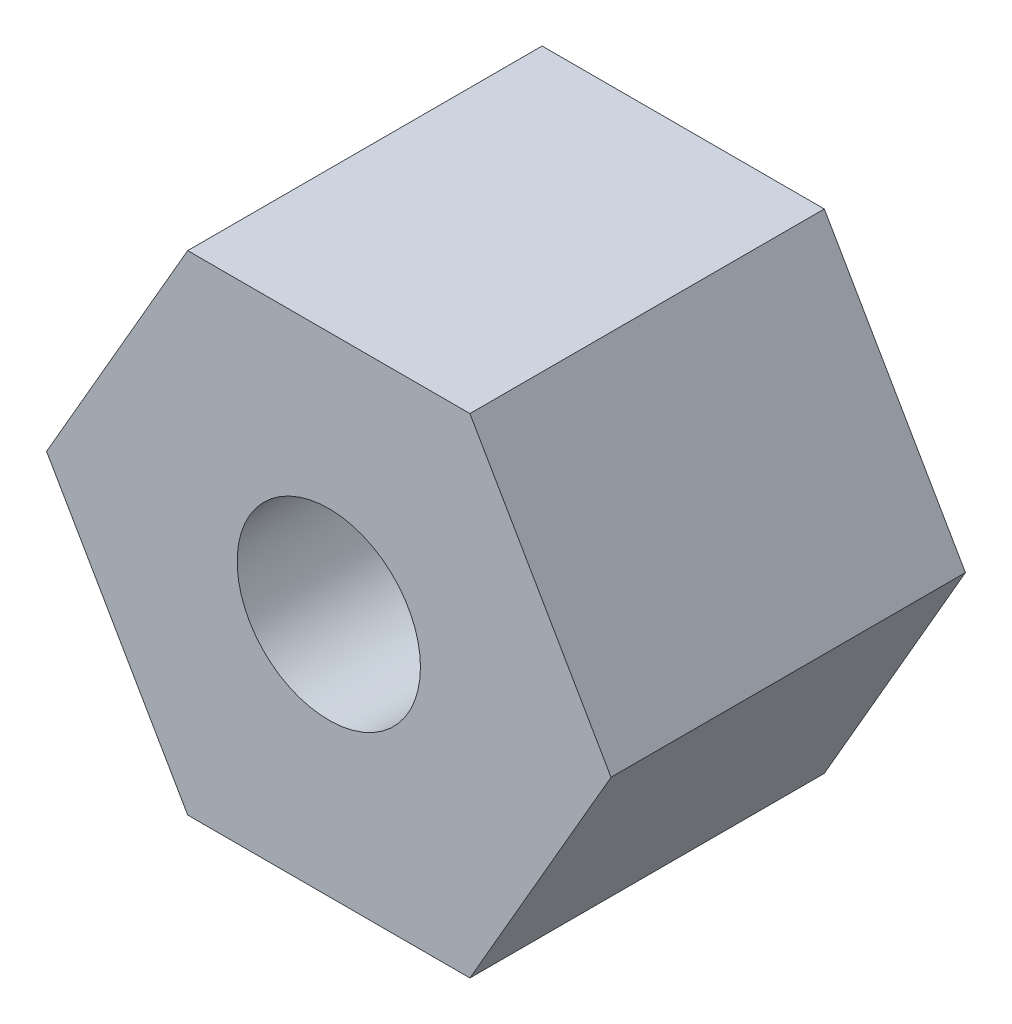
ISO-10303-21;
HEADER;
FILE_DESCRIPTION(('STEP AP214'),'2;1');
FILE_NAME('part.step','',(''),(''),'','','');
FILE_SCHEMA(('AUTOMOTIVE_DESIGN { 1 0 10303 214 1 1 1 1 }'));
ENDSEC;
DATA;
#1=APPLICATION_CONTEXT('core data for automotive mechanical design processes');
#2=APPLICATION_PROTOCOL_DEFINITION('international standard','automotive_design',2000,#1);
#3=PRODUCT_CONTEXT('',#1,'mechanical');
#4=PRODUCT('Part','Part','',(#3));
#5=PRODUCT_RELATED_PRODUCT_CATEGORY('part','',(#4));
#6=PRODUCT_DEFINITION_FORMATION('','',#4);
#7=PRODUCT_DEFINITION_CONTEXT('part definition',#1,'design');
#8=PRODUCT_DEFINITION('design','',#6,#7);
#9=PRODUCT_DEFINITION_SHAPE('','',#8);
#10=(LENGTH_UNIT() NAMED_UNIT(*) SI_UNIT(.MILLI.,.METRE.));
#11=(NAMED_UNIT(*) PLANE_ANGLE_UNIT() SI_UNIT($,.RADIAN.));
#12=(NAMED_UNIT(*) SI_UNIT($,.STERADIAN.) SOLID_ANGLE_UNIT());
#13=UNCERTAINTY_MEASURE_WITH_UNIT(LENGTH_MEASURE(1.E-05),#10,'distance_accuracy_value','');
#14=(GEOMETRIC_REPRESENTATION_CONTEXT(3) GLOBAL_UNCERTAINTY_ASSIGNED_CONTEXT((#13)) GLOBAL_UNIT_ASSIGNED_CONTEXT((#10,
#11,#12)) REPRESENTATION_CONTEXT('',''));
#15=CARTESIAN_POINT('',(0.,0.,0.));
#16=DIRECTION('',(0.,0.,1.));
#17=DIRECTION('',(1.,0.,0.));
#18=AXIS2_PLACEMENT_3D('',#15,#16,#17);
#19=CARTESIAN_POINT('',(0.,0.,5.8));
#20=DIRECTION('',(0.,0.,1.));
#21=DIRECTION('',(1.,0.,0.));
#22=AXIS2_PLACEMENT_3D('',#19,#20,#21);
#23=PLANE('',#22);
#24=DIRECTION('',(1.,0.,0.));
#25=VECTOR('',#24,1.);
#26=CARTESIAN_POINT('',(-2.3094010767585,-4.00000000000001,5.8));
#27=LINE('',#26,#25);
#28=CARTESIAN_POINT('',(-2.3094010767585,-4.00000000000001,5.8));
#29=VERTEX_POINT('',#28);
#30=CARTESIAN_POINT('',(2.30940107675851,-4.00000000000001,5.8));
#31=VERTEX_POINT('',#30);
#32=EDGE_CURVE('E131',#29,#31,#27,.T.);
#33=ORIENTED_EDGE('',*,*,#32,.T.);
#34=DIRECTION('',(0.5,0.866025403784439,0.));
#35=VECTOR('',#34,1.);
#36=CARTESIAN_POINT('',(2.30940107675851,-4.00000000000001,5.8));
#37=LINE('',#36,#35);
#38=CARTESIAN_POINT('',(4.61880215351702,0.,5.8));
#39=VERTEX_POINT('',#38);
#40=EDGE_CURVE('E89',#31,#39,#37,.T.);
#41=ORIENTED_EDGE('',*,*,#40,.T.);
#42=DIRECTION('',(-0.5,0.866025403784438,0.));
#43=VECTOR('',#42,1.);
#44=CARTESIAN_POINT('',(4.61880215351702,0.,5.8));
#45=LINE('',#44,#43);
#46=CARTESIAN_POINT('',(2.30940107675851,4.00000000000001,5.8));
#47=VERTEX_POINT('',#46);
#48=EDGE_CURVE('E102',#39,#47,#45,.T.);
#49=ORIENTED_EDGE('',*,*,#48,.T.);
#50=DIRECTION('',(-1.,0.,0.));
#51=VECTOR('',#50,1.);
#52=CARTESIAN_POINT('',(2.30940107675851,4.00000000000001,5.8));
#53=LINE('',#52,#51);
#54=CARTESIAN_POINT('',(-2.30940107675851,4.00000000000001,5.8));
#55=VERTEX_POINT('',#54);
#56=EDGE_CURVE('E96',#47,#55,#53,.T.);
#57=ORIENTED_EDGE('',*,*,#56,.T.);
#58=DIRECTION('',(-0.5,-0.866025403784438,0.));
#59=VECTOR('',#58,1.);
#60=CARTESIAN_POINT('',(-2.30940107675851,4.00000000000001,5.8));
#61=LINE('',#60,#59);
#62=CARTESIAN_POINT('',(-4.61880215351702,0.,5.8));
#63=VERTEX_POINT('',#62);
#64=EDGE_CURVE('E100',#55,#63,#61,.T.);
#65=ORIENTED_EDGE('',*,*,#64,.T.);
#66=DIRECTION('',(0.5,-0.866025403784438,0.));
#67=VECTOR('',#66,1.);
#68=CARTESIAN_POINT('',(-4.61880215351702,0.,5.8));
#69=LINE('',#68,#67);
#70=EDGE_CURVE('E52',#63,#29,#69,.T.);
#71=ORIENTED_EDGE('',*,*,#70,.T.);
#72=EDGE_LOOP('',(#33,#41,#49,#57,#65,#71));
#73=FACE_BOUND('',#72,.T.);
#74=CARTESIAN_POINT('',(0.,0.,5.8));
#75=DIRECTION('',(0.,0.,1.));
#76=DIRECTION('',(1.,0.,0.));
#77=AXIS2_PLACEMENT_3D('',#74,#75,#76);
#78=CIRCLE('',#77,1.5);
#79=CARTESIAN_POINT('',(1.5,0.,5.8));
#80=VERTEX_POINT('',#79);
#81=EDGE_CURVE('E124',#80,#80,#78,.T.);
#82=ORIENTED_EDGE('',*,*,#81,.F.);
#83=EDGE_LOOP('',(#82));
#84=FACE_BOUND('',#83,.T.);
#85=ADVANCED_FACE('F35',(#73,#84),#23,.T.);
#86=CARTESIAN_POINT('',(0.,0.,0.));
#87=DIRECTION('',(0.,0.,1.));
#88=DIRECTION('',(1.,0.,0.));
#89=AXIS2_PLACEMENT_3D('',#86,#87,#88);
#90=PLANE('',#89);
#91=DIRECTION('',(1.,0.,0.));
#92=VECTOR('',#91,1.);
#93=CARTESIAN_POINT('',(-2.3094010767585,-4.00000000000001,0.));
#94=LINE('',#93,#92);
#95=CARTESIAN_POINT('',(-2.3094010767585,-4.00000000000001,0.));
#96=VERTEX_POINT('',#95);
#97=CARTESIAN_POINT('',(2.30940107675851,-4.00000000000001,0.));
#98=VERTEX_POINT('',#97);
#99=EDGE_CURVE('E120',#96,#98,#94,.T.);
#100=ORIENTED_EDGE('',*,*,#99,.F.);
#101=DIRECTION('',(0.5,-0.866025403784438,0.));
#102=VECTOR('',#101,1.);
#103=CARTESIAN_POINT('',(-4.61880215351702,0.,0.));
#104=LINE('',#103,#102);
#105=CARTESIAN_POINT('',(-4.61880215351702,0.,0.));
#106=VERTEX_POINT('',#105);
#107=EDGE_CURVE('E81',#106,#96,#104,.T.);
#108=ORIENTED_EDGE('',*,*,#107,.F.);
#109=DIRECTION('',(-0.5,-0.866025403784438,0.));
#110=VECTOR('',#109,1.);
#111=CARTESIAN_POINT('',(-2.30940107675851,4.00000000000001,0.));
#112=LINE('',#111,#110);
#113=CARTESIAN_POINT('',(-2.30940107675851,4.00000000000001,0.));
#114=VERTEX_POINT('',#113);
#115=EDGE_CURVE('E75',#114,#106,#112,.T.);
#116=ORIENTED_EDGE('',*,*,#115,.F.);
#117=DIRECTION('',(-1.,0.,0.));
#118=VECTOR('',#117,1.);
#119=CARTESIAN_POINT('',(2.30940107675851,4.00000000000001,0.));
#120=LINE('',#119,#118);
#121=CARTESIAN_POINT('',(2.30940107675851,4.00000000000001,0.));
#122=VERTEX_POINT('',#121);
#123=EDGE_CURVE('E110',#122,#114,#120,.T.);
#124=ORIENTED_EDGE('',*,*,#123,.F.);
#125=DIRECTION('',(-0.5,0.866025403784438,0.));
#126=VECTOR('',#125,1.);
#127=CARTESIAN_POINT('',(4.61880215351702,0.,0.));
#128=LINE('',#127,#126);
#129=CARTESIAN_POINT('',(4.61880215351702,0.,0.));
#130=VERTEX_POINT('',#129);
#131=EDGE_CURVE('E126',#130,#122,#128,.T.);
#132=ORIENTED_EDGE('',*,*,#131,.F.);
#133=DIRECTION('',(0.5,0.866025403784439,0.));
#134=VECTOR('',#133,1.);
#135=CARTESIAN_POINT('',(2.30940107675851,-4.00000000000001,0.));
#136=LINE('',#135,#134);
#137=EDGE_CURVE('E123',#98,#130,#136,.T.);
#138=ORIENTED_EDGE('',*,*,#137,.F.);
#139=EDGE_LOOP('',(#100,#108,#116,#124,#132,#138));
#140=FACE_BOUND('',#139,.T.);
#141=CARTESIAN_POINT('',(0.,0.,0.));
#142=DIRECTION('',(0.,0.,1.));
#143=DIRECTION('',(1.,0.,0.));
#144=AXIS2_PLACEMENT_3D('',#141,#142,#143);
#145=CIRCLE('',#144,1.5);
#146=CARTESIAN_POINT('',(1.5,0.,0.));
#147=VERTEX_POINT('',#146);
#148=EDGE_CURVE('E224',#147,#147,#145,.T.);
#149=ORIENTED_EDGE('',*,*,#148,.T.);
#150=EDGE_LOOP('',(#149));
#151=FACE_BOUND('',#150,.T.);
#152=ADVANCED_FACE('F140',(#140,#151),#90,.F.);
#153=CARTESIAN_POINT('',(-2.3094010767585,-4.00000000000001,5.8));
#154=DIRECTION('',(0.,1.,0.));
#155=DIRECTION('',(-1.,0.,0.));
#156=AXIS2_PLACEMENT_3D('',#153,#154,#155);
#157=PLANE('',#156);
#158=ORIENTED_EDGE('',*,*,#99,.T.);
#159=DIRECTION('',(0.,0.,-1.));
#160=VECTOR('',#159,1.);
#161=CARTESIAN_POINT('',(2.30940107675851,-4.00000000000001,5.8));
#162=LINE('',#161,#160);
#163=EDGE_CURVE('E11',#31,#98,#162,.T.);
#164=ORIENTED_EDGE('',*,*,#163,.F.);
#165=ORIENTED_EDGE('',*,*,#32,.F.);
#166=DIRECTION('',(0.,0.,-1.));
#167=VECTOR('',#166,1.);
#168=CARTESIAN_POINT('',(-2.3094010767585,-4.00000000000001,5.8));
#169=LINE('',#168,#167);
#170=EDGE_CURVE('E116',#29,#96,#169,.T.);
#171=ORIENTED_EDGE('',*,*,#170,.T.);
#172=EDGE_LOOP('',(#158,#164,#165,#171));
#173=FACE_BOUND('',#172,.T.);
#174=ADVANCED_FACE('F37',(#173),#157,.F.);
#175=CARTESIAN_POINT('',(2.30940107675851,-4.00000000000001,5.8));
#176=DIRECTION('',(-0.866025403784439,0.5,0.));
#177=DIRECTION('',(-0.5,-0.866025403784439,0.));
#178=AXIS2_PLACEMENT_3D('',#175,#176,#177);
#179=PLANE('',#178);
#180=ORIENTED_EDGE('',*,*,#137,.T.);
#181=DIRECTION('',(0.,0.,-1.));
#182=VECTOR('',#181,1.);
#183=CARTESIAN_POINT('',(4.61880215351702,0.,5.8));
#184=LINE('',#183,#182);
#185=EDGE_CURVE('E44',#39,#130,#184,.T.);
#186=ORIENTED_EDGE('',*,*,#185,.F.);
#187=ORIENTED_EDGE('',*,*,#40,.F.);
#188=ORIENTED_EDGE('',*,*,#163,.T.);
#189=EDGE_LOOP('',(#180,#186,#187,#188));
#190=FACE_BOUND('',#189,.T.);
#191=ADVANCED_FACE('F165',(#190),#179,.F.);
#192=CARTESIAN_POINT('',(4.61880215351702,0.,5.8));
#193=DIRECTION('',(-0.866025403784438,-0.5,0.));
#194=DIRECTION('',(0.5,-0.866025403784438,0.));
#195=AXIS2_PLACEMENT_3D('',#192,#193,#194);
#196=PLANE('',#195);
#197=ORIENTED_EDGE('',*,*,#131,.T.);
#198=DIRECTION('',(0.,0.,-1.));
#199=VECTOR('',#198,1.);
#200=CARTESIAN_POINT('',(2.30940107675851,4.00000000000001,5.8));
#201=LINE('',#200,#199);
#202=EDGE_CURVE('E111',#47,#122,#201,.T.);
#203=ORIENTED_EDGE('',*,*,#202,.F.);
#204=ORIENTED_EDGE('',*,*,#48,.F.);
#205=ORIENTED_EDGE('',*,*,#185,.T.);
#206=EDGE_LOOP('',(#197,#203,#204,#205));
#207=FACE_BOUND('',#206,.T.);
#208=ADVANCED_FACE('F137',(#207),#196,.F.);
#209=CARTESIAN_POINT('',(2.30940107675851,4.00000000000001,5.8));
#210=DIRECTION('',(0.,-1.,0.));
#211=DIRECTION('',(1.,0.,0.));
#212=AXIS2_PLACEMENT_3D('',#209,#210,#211);
#213=PLANE('',#212);
#214=ORIENTED_EDGE('',*,*,#123,.T.);
#215=DIRECTION('',(0.,0.,-1.));
#216=VECTOR('',#215,1.);
#217=CARTESIAN_POINT('',(-2.30940107675851,4.00000000000001,5.8));
#218=LINE('',#217,#216);
#219=EDGE_CURVE('E107',#55,#114,#218,.T.);
#220=ORIENTED_EDGE('',*,*,#219,.F.);
#221=ORIENTED_EDGE('',*,*,#56,.F.);
#222=ORIENTED_EDGE('',*,*,#202,.T.);
#223=EDGE_LOOP('',(#214,#220,#221,#222));
#224=FACE_BOUND('',#223,.T.);
#225=ADVANCED_FACE('F108',(#224),#213,.F.);
#226=CARTESIAN_POINT('',(-2.30940107675851,4.00000000000001,5.8));
#227=DIRECTION('',(0.866025403784439,-0.5,0.));
#228=DIRECTION('',(0.5,0.866025403784439,0.));
#229=AXIS2_PLACEMENT_3D('',#226,#227,#228);
#230=PLANE('',#229);
#231=ORIENTED_EDGE('',*,*,#115,.T.);
#232=DIRECTION('',(0.,0.,-1.));
#233=VECTOR('',#232,1.);
#234=CARTESIAN_POINT('',(-4.61880215351702,0.,5.8));
#235=LINE('',#234,#233);
#236=EDGE_CURVE('E112',#63,#106,#235,.T.);
#237=ORIENTED_EDGE('',*,*,#236,.F.);
#238=ORIENTED_EDGE('',*,*,#64,.F.);
#239=ORIENTED_EDGE('',*,*,#219,.T.);
#240=EDGE_LOOP('',(#231,#237,#238,#239));
#241=FACE_BOUND('',#240,.T.);
#242=ADVANCED_FACE('F114',(#241),#230,.F.);
#243=CARTESIAN_POINT('',(-4.61880215351702,0.,5.8));
#244=DIRECTION('',(0.866025403784438,0.5,0.));
#245=DIRECTION('',(-0.5,0.866025403784438,0.));
#246=AXIS2_PLACEMENT_3D('',#243,#244,#245);
#247=PLANE('',#246);
#248=ORIENTED_EDGE('',*,*,#107,.T.);
#249=ORIENTED_EDGE('',*,*,#170,.F.);
#250=ORIENTED_EDGE('',*,*,#70,.F.);
#251=ORIENTED_EDGE('',*,*,#236,.T.);
#252=EDGE_LOOP('',(#248,#249,#250,#251));
#253=FACE_BOUND('',#252,.T.);
#254=ADVANCED_FACE('F145',(#253),#247,.F.);
#255=CARTESIAN_POINT('',(0.,0.,5.8));
#256=DIRECTION('',(0.,0.,-1.));
#257=DIRECTION('',(-1.,0.,0.));
#258=AXIS2_PLACEMENT_3D('',#255,#256,#257);
#259=CYLINDRICAL_SURFACE('',#258,1.5);
#260=ORIENTED_EDGE('',*,*,#81,.T.);
#261=EDGE_LOOP('',(#260));
#262=FACE_BOUND('',#261,.T.);
#263=ORIENTED_EDGE('',*,*,#148,.F.);
#264=EDGE_LOOP('',(#263));
#265=FACE_BOUND('',#264,.T.);
#266=ADVANCED_FACE('F147',(#262,#265),#259,.F.);
#267=CLOSED_SHELL('',(#85,#152,#174,#191,#208,#225,#242,#254,#266));
#268=MANIFOLD_SOLID_BREP('B2',#267);
#269=ADVANCED_BREP_SHAPE_REPRESENTATION('',(#18,#268),#14);
#270=SHAPE_DEFINITION_REPRESENTATION(#9,#269);
ENDSEC;
END-ISO-10303-21;
